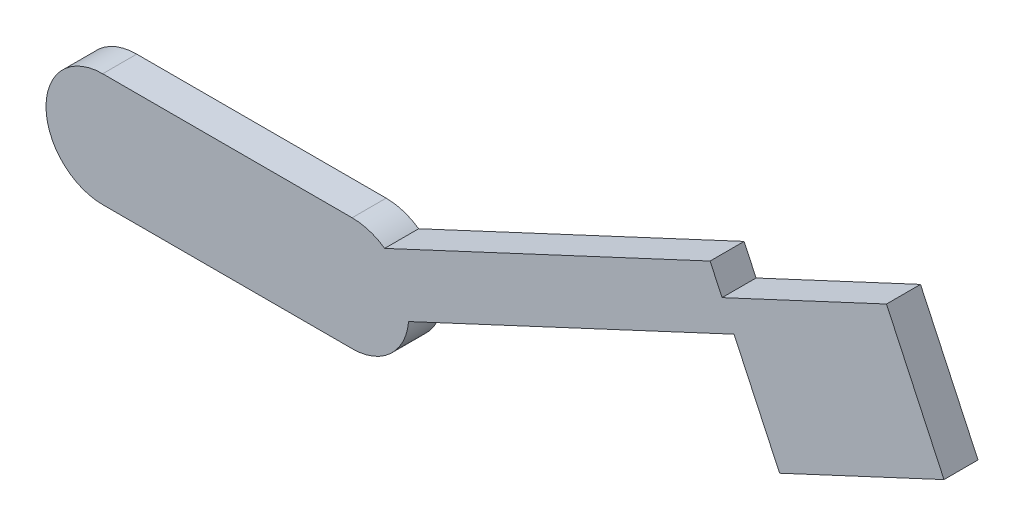
ISO-10303-21;
HEADER;
FILE_DESCRIPTION(('STEP AP214'),'2;1');
FILE_NAME('part.step','',(''),(''),'','','');
FILE_SCHEMA(('AUTOMOTIVE_DESIGN { 1 0 10303 214 1 1 1 1 }'));
ENDSEC;
DATA;
#1=APPLICATION_CONTEXT('core data for automotive mechanical design processes');
#2=APPLICATION_PROTOCOL_DEFINITION('international standard','automotive_design',2000,#1);
#3=PRODUCT_CONTEXT('',#1,'mechanical');
#4=PRODUCT('Part','Part','',(#3));
#5=PRODUCT_RELATED_PRODUCT_CATEGORY('part','',(#4));
#6=PRODUCT_DEFINITION_FORMATION('','',#4);
#7=PRODUCT_DEFINITION_CONTEXT('part definition',#1,'design');
#8=PRODUCT_DEFINITION('design','',#6,#7);
#9=PRODUCT_DEFINITION_SHAPE('','',#8);
#10=(LENGTH_UNIT() NAMED_UNIT(*) SI_UNIT(.MILLI.,.METRE.));
#11=(NAMED_UNIT(*) PLANE_ANGLE_UNIT() SI_UNIT($,.RADIAN.));
#12=(NAMED_UNIT(*) SI_UNIT($,.STERADIAN.) SOLID_ANGLE_UNIT());
#13=UNCERTAINTY_MEASURE_WITH_UNIT(LENGTH_MEASURE(1.E-05),#10,'distance_accuracy_value','');
#14=(GEOMETRIC_REPRESENTATION_CONTEXT(3) GLOBAL_UNCERTAINTY_ASSIGNED_CONTEXT((#13)) GLOBAL_UNIT_ASSIGNED_CONTEXT((#10,
#11,#12)) REPRESENTATION_CONTEXT('',''));
#15=CARTESIAN_POINT('',(0.,0.,0.));
#16=DIRECTION('',(0.,0.,1.));
#17=DIRECTION('',(1.,0.,0.));
#18=AXIS2_PLACEMENT_3D('',#15,#16,#17);
#19=CARTESIAN_POINT('',(22.,0.,3.));
#20=DIRECTION('',(0.,0.,-1.));
#21=DIRECTION('',(-1.,0.,0.));
#22=AXIS2_PLACEMENT_3D('',#19,#20,#21);
#23=CYLINDRICAL_SURFACE('',#22,5.);
#24=DIRECTION('',(0.,0.,-1.));
#25=VECTOR('',#24,1.);
#26=CARTESIAN_POINT('',(26.9809734904587,-0.435778713738269,3.));
#27=LINE('',#26,#25);
#28=CARTESIAN_POINT('',(26.9809734904587,-0.435778713738269,3.));
#29=VERTEX_POINT('',#28);
#30=CARTESIAN_POINT('',(26.9809734904587,-0.435778713738269,0.));
#31=VERTEX_POINT('',#30);
#32=EDGE_CURVE('E11',#29,#31,#27,.T.);
#33=ORIENTED_EDGE('',*,*,#32,.F.);
#34=CARTESIAN_POINT('',(22.,0.,3.));
#35=DIRECTION('',(0.,0.,1.));
#36=DIRECTION('',(1.,0.,0.));
#37=AXIS2_PLACEMENT_3D('',#34,#35,#36);
#38=CIRCLE('',#37,5.);
#39=CARTESIAN_POINT('',(22.,-5.,3.));
#40=VERTEX_POINT('',#39);
#41=EDGE_CURVE('E179',#40,#29,#38,.T.);
#42=ORIENTED_EDGE('',*,*,#41,.F.);
#43=DIRECTION('',(0.,0.,-1.));
#44=VECTOR('',#43,1.);
#45=CARTESIAN_POINT('',(22.,-5.,3.));
#46=LINE('',#45,#44);
#47=CARTESIAN_POINT('',(22.,-5.,0.));
#48=VERTEX_POINT('',#47);
#49=EDGE_CURVE('E200',#40,#48,#46,.T.);
#50=ORIENTED_EDGE('',*,*,#49,.T.);
#51=CARTESIAN_POINT('',(22.,0.,0.));
#52=DIRECTION('',(0.,0.,1.));
#53=DIRECTION('',(1.,0.,0.));
#54=AXIS2_PLACEMENT_3D('',#51,#52,#53);
#55=CIRCLE('',#54,5.);
#56=EDGE_CURVE('E185',#48,#31,#55,.T.);
#57=ORIENTED_EDGE('',*,*,#56,.T.);
#58=EDGE_LOOP('',(#33,#42,#50,#57));
#59=FACE_BOUND('',#58,.T.);
#60=ADVANCED_FACE('F39',(#59),#23,.T.);
#61=DIRECTION('',(0.,0.,-1.));
#62=VECTOR('',#61,1.);
#63=CARTESIAN_POINT('',(24.8678821817552,4.09576022144496,3.));
#64=LINE('',#63,#62);
#65=CARTESIAN_POINT('',(24.8678821817552,4.09576022144496,0.));
#66=VERTEX_POINT('',#65);
#67=CARTESIAN_POINT('',(24.8678821817552,4.09576022144496,3.));
#68=VERTEX_POINT('',#67);
#69=EDGE_CURVE('E50',#66,#68,#64,.F.);
#70=ORIENTED_EDGE('',*,*,#69,.F.);
#71=CARTESIAN_POINT('',(22.,5.,0.));
#72=VERTEX_POINT('',#71);
#73=EDGE_CURVE('E180',#66,#72,#55,.T.);
#74=ORIENTED_EDGE('',*,*,#73,.T.);
#75=DIRECTION('',(0.,0.,-1.));
#76=VECTOR('',#75,1.);
#77=CARTESIAN_POINT('',(22.,5.,3.));
#78=LINE('',#77,#76);
#79=CARTESIAN_POINT('',(22.,5.,3.));
#80=VERTEX_POINT('',#79);
#81=EDGE_CURVE('E198',#80,#72,#78,.T.);
#82=ORIENTED_EDGE('',*,*,#81,.F.);
#83=EDGE_CURVE('E182',#68,#80,#38,.T.);
#84=ORIENTED_EDGE('',*,*,#83,.F.);
#85=EDGE_LOOP('',(#70,#74,#82,#84));
#86=FACE_BOUND('',#85,.T.);
#87=ADVANCED_FACE('F223',(#86),#23,.T.);
#88=CARTESIAN_POINT('',(0.,0.,3.));
#89=DIRECTION('',(0.,0.,-1.));
#90=DIRECTION('',(-1.,0.,0.));
#91=AXIS2_PLACEMENT_3D('',#88,#89,#90);
#92=CYLINDRICAL_SURFACE('',#91,5.);
#93=DIRECTION('',(0.,0.,-1.));
#94=VECTOR('',#93,1.);
#95=CARTESIAN_POINT('',(0.,-5.,3.));
#96=LINE('',#95,#94);
#97=CARTESIAN_POINT('',(0.,-5.,3.));
#98=VERTEX_POINT('',#97);
#99=CARTESIAN_POINT('',(0.,-5.,0.));
#100=VERTEX_POINT('',#99);
#101=EDGE_CURVE('E203',#98,#100,#96,.T.);
#102=ORIENTED_EDGE('',*,*,#101,.F.);
#103=CARTESIAN_POINT('',(0.,0.,3.));
#104=DIRECTION('',(0.,0.,1.));
#105=DIRECTION('',(1.,0.,0.));
#106=AXIS2_PLACEMENT_3D('',#103,#104,#105);
#107=CIRCLE('',#106,5.);
#108=CARTESIAN_POINT('',(0.,5.,3.));
#109=VERTEX_POINT('',#108);
#110=EDGE_CURVE('E202',#109,#98,#107,.T.);
#111=ORIENTED_EDGE('',*,*,#110,.F.);
#112=DIRECTION('',(0.,0.,-1.));
#113=VECTOR('',#112,1.);
#114=CARTESIAN_POINT('',(0.,5.,3.));
#115=LINE('',#114,#113);
#116=CARTESIAN_POINT('',(0.,5.,0.));
#117=VERTEX_POINT('',#116);
#118=EDGE_CURVE('E188',#109,#117,#115,.T.);
#119=ORIENTED_EDGE('',*,*,#118,.T.);
#120=CARTESIAN_POINT('',(0.,0.,0.));
#121=DIRECTION('',(0.,0.,1.));
#122=DIRECTION('',(1.,0.,0.));
#123=AXIS2_PLACEMENT_3D('',#120,#121,#122);
#124=CIRCLE('',#123,5.);
#125=EDGE_CURVE('E204',#117,#100,#124,.T.);
#126=ORIENTED_EDGE('',*,*,#125,.T.);
#127=EDGE_LOOP('',(#102,#111,#119,#126));
#128=FACE_BOUND('',#127,.T.);
#129=ADVANCED_FACE('F41',(#128),#92,.T.);
#130=CARTESIAN_POINT('',(0.,0.,3.));
#131=DIRECTION('',(0.,0.,1.));
#132=DIRECTION('',(1.,0.,0.));
#133=AXIS2_PLACEMENT_3D('',#130,#131,#132);
#134=PLANE('',#133);
#135=ORIENTED_EDGE('',*,*,#41,.T.);
#136=DIRECTION('',(0.90630778703665,0.422618261740698,0.));
#137=VECTOR('',#136,1.);
#138=CARTESIAN_POINT('',(55.6836259876711,12.9484879550735,3.));
#139=LINE('',#138,#137);
#140=CARTESIAN_POINT('',(55.6836259876711,12.9484879550735,3.));
#141=VERTEX_POINT('',#140);
#142=EDGE_CURVE('E133',#29,#141,#139,.T.);
#143=ORIENTED_EDGE('',*,*,#142,.T.);
#144=DIRECTION('',(0.422618261740699,-0.90630778703665,0.));
#145=VECTOR('',#144,1.);
#146=CARTESIAN_POINT('',(59.6984994742078,4.33856397822537,3.));
#147=LINE('',#146,#145);
#148=CARTESIAN_POINT('',(59.6984994742078,4.33856397822537,3.));
#149=VERTEX_POINT('',#148);
#150=EDGE_CURVE('E126',#141,#149,#147,.T.);
#151=ORIENTED_EDGE('',*,*,#150,.T.);
#152=DIRECTION('',(0.90630778703665,0.422618261740698,0.));
#153=VECTOR('',#152,1.);
#154=CARTESIAN_POINT('',(74.1994240667942,11.1004561660765,3.));
#155=LINE('',#154,#153);
#156=CARTESIAN_POINT('',(74.1994240667942,11.1004561660765,3.));
#157=VERTEX_POINT('',#156);
#158=EDGE_CURVE('E135',#149,#157,#155,.T.);
#159=ORIENTED_EDGE('',*,*,#158,.T.);
#160=DIRECTION('',(-0.422618261740698,0.90630778703665,0.));
#161=VECTOR('',#160,1.);
#162=CARTESIAN_POINT('',(69.1280049259058,21.9761496105163,3.));
#163=LINE('',#162,#161);
#164=CARTESIAN_POINT('',(69.1280049259058,21.9761496105163,3.));
#165=VERTEX_POINT('',#164);
#166=EDGE_CURVE('E150',#157,#165,#163,.T.);
#167=ORIENTED_EDGE('',*,*,#166,.T.);
#168=DIRECTION('',(-0.90630778703665,-0.422618261740699,0.));
#169=VECTOR('',#168,1.);
#170=CARTESIAN_POINT('',(54.6270803333194,15.2142574226652,3.));
#171=LINE('',#170,#169);
#172=CARTESIAN_POINT('',(54.6270803333194,15.2142574226652,3.));
#173=VERTEX_POINT('',#172);
#174=EDGE_CURVE('E220',#165,#173,#171,.T.);
#175=ORIENTED_EDGE('',*,*,#174,.T.);
#176=DIRECTION('',(-0.422618261740698,0.90630778703665,0.));
#177=VECTOR('',#176,1.);
#178=CARTESIAN_POINT('',(53.5705346789677,17.4800268902568,3.));
#179=LINE('',#178,#177);
#180=CARTESIAN_POINT('',(53.5705346789677,17.4800268902568,3.));
#181=VERTEX_POINT('',#180);
#182=EDGE_CURVE('E162',#173,#181,#179,.T.);
#183=ORIENTED_EDGE('',*,*,#182,.T.);
#184=DIRECTION('',(-0.90630778703665,-0.422618261740699,0.));
#185=VECTOR('',#184,1.);
#186=CARTESIAN_POINT('',(20.9434543456482,2.26576946759163,3.));
#187=LINE('',#186,#185);
#188=EDGE_CURVE('E167',#181,#68,#187,.T.);
#189=ORIENTED_EDGE('',*,*,#188,.T.);
#190=ORIENTED_EDGE('',*,*,#83,.T.);
#191=DIRECTION('',(-1.,0.,0.));
#192=VECTOR('',#191,1.);
#193=CARTESIAN_POINT('',(0.,5.,3.));
#194=LINE('',#193,#192);
#195=EDGE_CURVE('E190',#80,#109,#194,.T.);
#196=ORIENTED_EDGE('',*,*,#195,.T.);
#197=ORIENTED_EDGE('',*,*,#110,.T.);
#198=DIRECTION('',(1.,0.,0.));
#199=VECTOR('',#198,1.);
#200=CARTESIAN_POINT('',(0.,-5.,3.));
#201=LINE('',#200,#199);
#202=EDGE_CURVE('E184',#98,#40,#201,.T.);
#203=ORIENTED_EDGE('',*,*,#202,.T.);
#204=EDGE_LOOP('',(#135,#143,#151,#159,#167,#175,#183,#189,#190,#196,#197,#203));
#205=FACE_BOUND('',#204,.T.);
#206=ADVANCED_FACE('F132',(#205),#134,.T.);
#207=CARTESIAN_POINT('',(0.,0.,0.));
#208=DIRECTION('',(0.,0.,1.));
#209=DIRECTION('',(1.,0.,0.));
#210=AXIS2_PLACEMENT_3D('',#207,#208,#209);
#211=PLANE('',#210);
#212=ORIENTED_EDGE('',*,*,#73,.F.);
#213=DIRECTION('',(-0.90630778703665,-0.422618261740699,0.));
#214=VECTOR('',#213,1.);
#215=CARTESIAN_POINT('',(20.9434543456482,2.26576946759163,0.));
#216=LINE('',#215,#214);
#217=CARTESIAN_POINT('',(53.5705346789677,17.4800268902568,0.));
#218=VERTEX_POINT('',#217);
#219=EDGE_CURVE('E163',#218,#66,#216,.T.);
#220=ORIENTED_EDGE('',*,*,#219,.F.);
#221=DIRECTION('',(-0.422618261740698,0.90630778703665,0.));
#222=VECTOR('',#221,1.);
#223=CARTESIAN_POINT('',(53.5705346789677,17.4800268902568,0.));
#224=LINE('',#223,#222);
#225=CARTESIAN_POINT('',(54.6270803333194,15.2142574226652,0.));
#226=VERTEX_POINT('',#225);
#227=EDGE_CURVE('E156',#226,#218,#224,.T.);
#228=ORIENTED_EDGE('',*,*,#227,.F.);
#229=DIRECTION('',(-0.90630778703665,-0.422618261740699,0.));
#230=VECTOR('',#229,1.);
#231=CARTESIAN_POINT('',(54.6270803333194,15.2142574226652,0.));
#232=LINE('',#231,#230);
#233=CARTESIAN_POINT('',(69.1280049259058,21.9761496105163,0.));
#234=VERTEX_POINT('',#233);
#235=EDGE_CURVE('E53',#234,#226,#232,.T.);
#236=ORIENTED_EDGE('',*,*,#235,.F.);
#237=DIRECTION('',(-0.422618261740698,0.90630778703665,0.));
#238=VECTOR('',#237,1.);
#239=CARTESIAN_POINT('',(69.1280049259058,21.9761496105163,0.));
#240=LINE('',#239,#238);
#241=CARTESIAN_POINT('',(74.1994240667942,11.1004561660765,0.));
#242=VERTEX_POINT('',#241);
#243=EDGE_CURVE('E338',#242,#234,#240,.T.);
#244=ORIENTED_EDGE('',*,*,#243,.F.);
#245=DIRECTION('',(0.90630778703665,0.422618261740698,0.));
#246=VECTOR('',#245,1.);
#247=CARTESIAN_POINT('',(74.1994240667942,11.1004561660765,0.));
#248=LINE('',#247,#246);
#249=CARTESIAN_POINT('',(59.6984994742078,4.33856397822537,0.));
#250=VERTEX_POINT('',#249);
#251=EDGE_CURVE('E337',#250,#242,#248,.T.);
#252=ORIENTED_EDGE('',*,*,#251,.F.);
#253=DIRECTION('',(0.422618261740699,-0.90630778703665,0.));
#254=VECTOR('',#253,1.);
#255=CARTESIAN_POINT('',(59.6984994742078,4.33856397822537,0.));
#256=LINE('',#255,#254);
#257=CARTESIAN_POINT('',(55.6836259876711,12.9484879550735,0.));
#258=VERTEX_POINT('',#257);
#259=EDGE_CURVE('E151',#258,#250,#256,.T.);
#260=ORIENTED_EDGE('',*,*,#259,.F.);
#261=DIRECTION('',(0.90630778703665,0.422618261740698,0.));
#262=VECTOR('',#261,1.);
#263=CARTESIAN_POINT('',(55.6836259876711,12.9484879550735,0.));
#264=LINE('',#263,#262);
#265=EDGE_CURVE('E153',#31,#258,#264,.T.);
#266=ORIENTED_EDGE('',*,*,#265,.F.);
#267=ORIENTED_EDGE('',*,*,#56,.F.);
#268=DIRECTION('',(1.,0.,0.));
#269=VECTOR('',#268,1.);
#270=CARTESIAN_POINT('',(0.,-5.,0.));
#271=LINE('',#270,#269);
#272=EDGE_CURVE('E178',#100,#48,#271,.T.);
#273=ORIENTED_EDGE('',*,*,#272,.F.);
#274=ORIENTED_EDGE('',*,*,#125,.F.);
#275=DIRECTION('',(-1.,0.,0.));
#276=VECTOR('',#275,1.);
#277=CARTESIAN_POINT('',(0.,5.,0.));
#278=LINE('',#277,#276);
#279=EDGE_CURVE('E189',#72,#117,#278,.T.);
#280=ORIENTED_EDGE('',*,*,#279,.F.);
#281=EDGE_LOOP('',(#212,#220,#228,#236,#244,#252,#260,#266,#267,#273,#274,#280));
#282=FACE_BOUND('',#281,.T.);
#283=ADVANCED_FACE('F225',(#282),#211,.F.);
#284=CARTESIAN_POINT('',(0.,-5.,3.));
#285=DIRECTION('',(0.,1.,0.));
#286=DIRECTION('',(0.,0.,1.));
#287=AXIS2_PLACEMENT_3D('',#284,#285,#286);
#288=PLANE('',#287);
#289=ORIENTED_EDGE('',*,*,#272,.T.);
#290=ORIENTED_EDGE('',*,*,#49,.F.);
#291=ORIENTED_EDGE('',*,*,#202,.F.);
#292=ORIENTED_EDGE('',*,*,#101,.T.);
#293=EDGE_LOOP('',(#289,#290,#291,#292));
#294=FACE_BOUND('',#293,.T.);
#295=ADVANCED_FACE('F233',(#294),#288,.F.);
#296=CARTESIAN_POINT('',(0.,5.,3.));
#297=DIRECTION('',(0.,-1.,0.));
#298=DIRECTION('',(0.,0.,-1.));
#299=AXIS2_PLACEMENT_3D('',#296,#297,#298);
#300=PLANE('',#299);
#301=ORIENTED_EDGE('',*,*,#279,.T.);
#302=ORIENTED_EDGE('',*,*,#118,.F.);
#303=ORIENTED_EDGE('',*,*,#195,.F.);
#304=ORIENTED_EDGE('',*,*,#81,.T.);
#305=EDGE_LOOP('',(#301,#302,#303,#304));
#306=FACE_BOUND('',#305,.T.);
#307=ADVANCED_FACE('F230',(#306),#300,.F.);
#308=CARTESIAN_POINT('',(55.6836259876711,12.9484879550735,3.));
#309=DIRECTION('',(-0.422618261740698,0.90630778703665,0.));
#310=DIRECTION('',(-0.90630778703665,-0.422618261740698,0.));
#311=AXIS2_PLACEMENT_3D('',#308,#309,#310);
#312=PLANE('',#311);
#313=ORIENTED_EDGE('',*,*,#142,.F.);
#314=ORIENTED_EDGE('',*,*,#32,.T.);
#315=ORIENTED_EDGE('',*,*,#265,.T.);
#316=DIRECTION('',(0.,0.,-1.));
#317=VECTOR('',#316,1.);
#318=CARTESIAN_POINT('',(55.6836259876711,12.9484879550735,3.));
#319=LINE('',#318,#317);
#320=EDGE_CURVE('E172',#141,#258,#319,.T.);
#321=ORIENTED_EDGE('',*,*,#320,.F.);
#322=EDGE_LOOP('',(#313,#314,#315,#321));
#323=FACE_BOUND('',#322,.T.);
#324=ADVANCED_FACE('F238',(#323),#312,.F.);
#325=CARTESIAN_POINT('',(20.9434543456482,2.26576946759163,3.));
#326=DIRECTION('',(0.422618261740699,-0.90630778703665,0.));
#327=DIRECTION('',(0.90630778703665,0.422618261740699,0.));
#328=AXIS2_PLACEMENT_3D('',#325,#326,#327);
#329=PLANE('',#328);
#330=ORIENTED_EDGE('',*,*,#219,.T.);
#331=ORIENTED_EDGE('',*,*,#69,.T.);
#332=ORIENTED_EDGE('',*,*,#188,.F.);
#333=DIRECTION('',(0.,0.,-1.));
#334=VECTOR('',#333,1.);
#335=CARTESIAN_POINT('',(53.5705346789677,17.4800268902568,3.));
#336=LINE('',#335,#334);
#337=EDGE_CURVE('E169',#181,#218,#336,.T.);
#338=ORIENTED_EDGE('',*,*,#337,.T.);
#339=EDGE_LOOP('',(#330,#331,#332,#338));
#340=FACE_BOUND('',#339,.T.);
#341=ADVANCED_FACE('F211',(#340),#329,.F.);
#342=CARTESIAN_POINT('',(53.5705346789677,17.4800268902568,3.));
#343=DIRECTION('',(-0.90630778703665,-0.422618261740698,0.));
#344=DIRECTION('',(0.422618261740699,-0.906307787036651,0.));
#345=AXIS2_PLACEMENT_3D('',#342,#343,#344);
#346=PLANE('',#345);
#347=ORIENTED_EDGE('',*,*,#182,.F.);
#348=DIRECTION('',(0.,0.,-1.));
#349=VECTOR('',#348,1.);
#350=CARTESIAN_POINT('',(54.6270803333194,15.2142574226652,3.));
#351=LINE('',#350,#349);
#352=EDGE_CURVE('E345',#173,#226,#351,.T.);
#353=ORIENTED_EDGE('',*,*,#352,.T.);
#354=ORIENTED_EDGE('',*,*,#227,.T.);
#355=ORIENTED_EDGE('',*,*,#337,.F.);
#356=EDGE_LOOP('',(#347,#353,#354,#355));
#357=FACE_BOUND('',#356,.T.);
#358=ADVANCED_FACE('F218',(#357),#346,.F.);
#359=CARTESIAN_POINT('',(59.6984994742078,4.33856397822537,3.));
#360=DIRECTION('',(0.90630778703665,0.422618261740698,0.));
#361=DIRECTION('',(-0.422618261740698,0.90630778703665,0.));
#362=AXIS2_PLACEMENT_3D('',#359,#360,#361);
#363=PLANE('',#362);
#364=ORIENTED_EDGE('',*,*,#150,.F.);
#365=ORIENTED_EDGE('',*,*,#320,.T.);
#366=ORIENTED_EDGE('',*,*,#259,.T.);
#367=DIRECTION('',(0.,0.,-1.));
#368=VECTOR('',#367,1.);
#369=CARTESIAN_POINT('',(59.6984994742078,4.33856397822537,3.));
#370=LINE('',#369,#368);
#371=EDGE_CURVE('E141',#149,#250,#370,.T.);
#372=ORIENTED_EDGE('',*,*,#371,.F.);
#373=EDGE_LOOP('',(#364,#365,#366,#372));
#374=FACE_BOUND('',#373,.T.);
#375=ADVANCED_FACE('F149',(#374),#363,.F.);
#376=CARTESIAN_POINT('',(74.1994240667942,11.1004561660765,3.));
#377=DIRECTION('',(-0.422618261740698,0.90630778703665,0.));
#378=DIRECTION('',(-0.90630778703665,-0.422618261740698,0.));
#379=AXIS2_PLACEMENT_3D('',#376,#377,#378);
#380=PLANE('',#379);
#381=ORIENTED_EDGE('',*,*,#251,.T.);
#382=DIRECTION('',(0.,0.,-1.));
#383=VECTOR('',#382,1.);
#384=CARTESIAN_POINT('',(74.1994240667942,11.1004561660765,3.));
#385=LINE('',#384,#383);
#386=EDGE_CURVE('E144',#157,#242,#385,.T.);
#387=ORIENTED_EDGE('',*,*,#386,.F.);
#388=ORIENTED_EDGE('',*,*,#158,.F.);
#389=ORIENTED_EDGE('',*,*,#371,.T.);
#390=EDGE_LOOP('',(#381,#387,#388,#389));
#391=FACE_BOUND('',#390,.T.);
#392=ADVANCED_FACE('F142',(#391),#380,.F.);
#393=CARTESIAN_POINT('',(69.1280049259058,21.9761496105163,3.));
#394=DIRECTION('',(-0.90630778703665,-0.422618261740698,0.));
#395=DIRECTION('',(0.422618261740698,-0.906307787036651,0.));
#396=AXIS2_PLACEMENT_3D('',#393,#394,#395);
#397=PLANE('',#396);
#398=ORIENTED_EDGE('',*,*,#243,.T.);
#399=DIRECTION('',(0.,0.,-1.));
#400=VECTOR('',#399,1.);
#401=CARTESIAN_POINT('',(69.1280049259058,21.9761496105163,3.));
#402=LINE('',#401,#400);
#403=EDGE_CURVE('E158',#165,#234,#402,.T.);
#404=ORIENTED_EDGE('',*,*,#403,.F.);
#405=ORIENTED_EDGE('',*,*,#166,.F.);
#406=ORIENTED_EDGE('',*,*,#386,.T.);
#407=EDGE_LOOP('',(#398,#404,#405,#406));
#408=FACE_BOUND('',#407,.T.);
#409=ADVANCED_FACE('F311',(#408),#397,.F.);
#410=CARTESIAN_POINT('',(54.6270803333194,15.2142574226652,3.));
#411=DIRECTION('',(0.422618261740698,-0.90630778703665,0.));
#412=DIRECTION('',(0.90630778703665,0.422618261740699,0.));
#413=AXIS2_PLACEMENT_3D('',#410,#411,#412);
#414=PLANE('',#413);
#415=ORIENTED_EDGE('',*,*,#235,.T.);
#416=ORIENTED_EDGE('',*,*,#352,.F.);
#417=ORIENTED_EDGE('',*,*,#174,.F.);
#418=ORIENTED_EDGE('',*,*,#403,.T.);
#419=EDGE_LOOP('',(#415,#416,#417,#418));
#420=FACE_BOUND('',#419,.T.);
#421=ADVANCED_FACE('F321',(#420),#414,.F.);
#422=CLOSED_SHELL('',(#60,#87,#129,#206,#283,#295,#307,#324,#341,#358,#375,#392,#409,#421));
#423=MANIFOLD_SOLID_BREP('B2',#422);
#424=ADVANCED_BREP_SHAPE_REPRESENTATION('',(#18,#423),#14);
#425=SHAPE_DEFINITION_REPRESENTATION(#9,#424);
ENDSEC;
END-ISO-10303-21;
